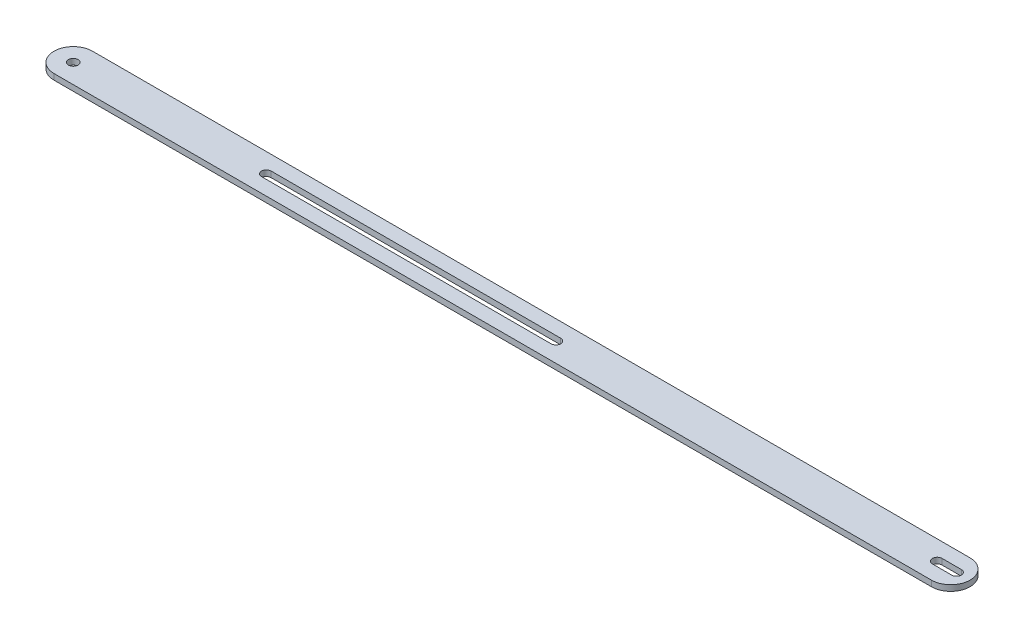
ISO-10303-21;
HEADER;
FILE_DESCRIPTION(('STEP AP214'),'2;1');
FILE_NAME('part.step','',(''),(''),'','','');
FILE_SCHEMA(('AUTOMOTIVE_DESIGN { 1 0 10303 214 1 1 1 1 }'));
ENDSEC;
DATA;
#1=APPLICATION_CONTEXT('core data for automotive mechanical design processes');
#2=APPLICATION_PROTOCOL_DEFINITION('international standard','automotive_design',2000,#1);
#3=PRODUCT_CONTEXT('',#1,'mechanical');
#4=PRODUCT('Part','Part','',(#3));
#5=PRODUCT_RELATED_PRODUCT_CATEGORY('part','',(#4));
#6=PRODUCT_DEFINITION_FORMATION('','',#4);
#7=PRODUCT_DEFINITION_CONTEXT('part definition',#1,'design');
#8=PRODUCT_DEFINITION('design','',#6,#7);
#9=PRODUCT_DEFINITION_SHAPE('','',#8);
#10=(LENGTH_UNIT() NAMED_UNIT(*) SI_UNIT(.MILLI.,.METRE.));
#11=(NAMED_UNIT(*) PLANE_ANGLE_UNIT() SI_UNIT($,.RADIAN.));
#12=(NAMED_UNIT(*) SI_UNIT($,.STERADIAN.) SOLID_ANGLE_UNIT());
#13=UNCERTAINTY_MEASURE_WITH_UNIT(LENGTH_MEASURE(1.E-05),#10,'distance_accuracy_value','');
#14=(GEOMETRIC_REPRESENTATION_CONTEXT(3) GLOBAL_UNCERTAINTY_ASSIGNED_CONTEXT((#13)) GLOBAL_UNIT_ASSIGNED_CONTEXT((#10,
#11,#12)) REPRESENTATION_CONTEXT('',''));
#15=CARTESIAN_POINT('',(0.,0.,0.));
#16=DIRECTION('',(0.,0.,1.));
#17=DIRECTION('',(1.,0.,0.));
#18=AXIS2_PLACEMENT_3D('',#15,#16,#17);
#19=CARTESIAN_POINT('',(-227.25,3.,0.));
#20=DIRECTION('',(0.,1.,0.));
#21=DIRECTION('',(0.,0.,1.));
#22=AXIS2_PLACEMENT_3D('',#19,#20,#21);
#23=PLANE('',#22);
#24=CARTESIAN_POINT('',(-127.25,3.,0.));
#25=DIRECTION('',(0.,1.,0.));
#26=DIRECTION('',(0.,0.,1.));
#27=AXIS2_PLACEMENT_3D('',#24,#25,#26);
#28=CIRCLE('',#27,2.5);
#29=CARTESIAN_POINT('',(-127.25,3.,-2.5));
#30=VERTEX_POINT('',#29);
#31=CARTESIAN_POINT('',(-127.25,3.,2.5));
#32=VERTEX_POINT('',#31);
#33=EDGE_CURVE('E50',#30,#32,#28,.T.);
#34=ORIENTED_EDGE('',*,*,#33,.F.);
#35=DIRECTION('',(-1.,0.,0.));
#36=VECTOR('',#35,1.);
#37=CARTESIAN_POINT('',(-127.25,3.,-2.5));
#38=LINE('',#37,#36);
#39=CARTESIAN_POINT('',(22.75,3.,-2.5));
#40=VERTEX_POINT('',#39);
#41=EDGE_CURVE('E142',#40,#30,#38,.T.);
#42=ORIENTED_EDGE('',*,*,#41,.F.);
#43=CARTESIAN_POINT('',(22.75,3.,0.));
#44=DIRECTION('',(0.,1.,0.));
#45=DIRECTION('',(0.,0.,1.));
#46=AXIS2_PLACEMENT_3D('',#43,#44,#45);
#47=CIRCLE('',#46,2.5);
#48=CARTESIAN_POINT('',(22.75,3.,2.5));
#49=VERTEX_POINT('',#48);
#50=EDGE_CURVE('E145',#49,#40,#47,.T.);
#51=ORIENTED_EDGE('',*,*,#50,.F.);
#52=DIRECTION('',(1.,0.,0.));
#53=VECTOR('',#52,1.);
#54=CARTESIAN_POINT('',(-127.25,3.,2.5));
#55=LINE('',#54,#53);
#56=EDGE_CURVE('E151',#32,#49,#55,.T.);
#57=ORIENTED_EDGE('',*,*,#56,.F.);
#58=EDGE_LOOP('',(#34,#42,#51,#57));
#59=FACE_BOUND('',#58,.T.);
#60=CARTESIAN_POINT('',(-227.25,3.,0.));
#61=DIRECTION('',(0.,1.,0.));
#62=DIRECTION('',(0.,0.,1.));
#63=AXIS2_PLACEMENT_3D('',#60,#61,#62);
#64=CIRCLE('',#63,10.0000000000001);
#65=CARTESIAN_POINT('',(-227.25,3.,-10.0000000000001));
#66=VERTEX_POINT('',#65);
#67=CARTESIAN_POINT('',(-227.25,3.,10.0000000000001));
#68=VERTEX_POINT('',#67);
#69=EDGE_CURVE('E198',#66,#68,#64,.T.);
#70=ORIENTED_EDGE('',*,*,#69,.T.);
#71=DIRECTION('',(1.,0.,0.));
#72=VECTOR('',#71,1.);
#73=CARTESIAN_POINT('',(-227.25,3.,10.0000000000001));
#74=LINE('',#73,#72);
#75=CARTESIAN_POINT('',(227.25,3.,10.0000000000001));
#76=VERTEX_POINT('',#75);
#77=EDGE_CURVE('E201',#68,#76,#74,.T.);
#78=ORIENTED_EDGE('',*,*,#77,.T.);
#79=CARTESIAN_POINT('',(227.25,3.,0.));
#80=DIRECTION('',(0.,1.,0.));
#81=DIRECTION('',(0.,0.,1.));
#82=AXIS2_PLACEMENT_3D('',#79,#80,#81);
#83=CIRCLE('',#82,10.0000000000001);
#84=CARTESIAN_POINT('',(227.25,3.,-10.0000000000001));
#85=VERTEX_POINT('',#84);
#86=EDGE_CURVE('E204',#76,#85,#83,.T.);
#87=ORIENTED_EDGE('',*,*,#86,.T.);
#88=DIRECTION('',(-1.,0.,0.));
#89=VECTOR('',#88,1.);
#90=CARTESIAN_POINT('',(-227.25,3.,-10.0000000000001));
#91=LINE('',#90,#89);
#92=EDGE_CURVE('E206',#85,#66,#91,.T.);
#93=ORIENTED_EDGE('',*,*,#92,.T.);
#94=EDGE_LOOP('',(#70,#78,#87,#93));
#95=FACE_BOUND('',#94,.T.);
#96=CARTESIAN_POINT('',(-227.25,3.,0.));
#97=DIRECTION('',(0.,1.,0.));
#98=DIRECTION('',(0.,0.,1.));
#99=AXIS2_PLACEMENT_3D('',#96,#97,#98);
#100=CIRCLE('',#99,2.5);
#101=CARTESIAN_POINT('',(-227.25,3.,2.49999999999995));
#102=VERTEX_POINT('',#101);
#103=EDGE_CURVE('E192',#102,#102,#100,.T.);
#104=ORIENTED_EDGE('',*,*,#103,.F.);
#105=EDGE_LOOP('',(#104));
#106=FACE_BOUND('',#105,.T.);
#107=DIRECTION('',(-1.,0.,0.));
#108=VECTOR('',#107,1.);
#109=CARTESIAN_POINT('',(230.25,3.,-2.50000000000018));
#110=LINE('',#109,#108);
#111=CARTESIAN_POINT('',(230.25,3.,-2.50000000000018));
#112=VERTEX_POINT('',#111);
#113=CARTESIAN_POINT('',(220.25,3.,-2.50000000000017));
#114=VERTEX_POINT('',#113);
#115=EDGE_CURVE('E163',#112,#114,#110,.T.);
#116=ORIENTED_EDGE('',*,*,#115,.F.);
#117=CARTESIAN_POINT('',(230.25,3.,-1.76430556873281E-13));
#118=DIRECTION('',(0.,1.,0.));
#119=DIRECTION('',(0.,0.,1.));
#120=AXIS2_PLACEMENT_3D('',#117,#118,#119);
#121=CIRCLE('',#120,2.5);
#122=CARTESIAN_POINT('',(230.25,3.,2.49999999999982));
#123=VERTEX_POINT('',#122);
#124=EDGE_CURVE('E161',#123,#112,#121,.T.);
#125=ORIENTED_EDGE('',*,*,#124,.F.);
#126=DIRECTION('',(1.,0.,0.));
#127=VECTOR('',#126,1.);
#128=CARTESIAN_POINT('',(230.25,3.,2.49999999999982));
#129=LINE('',#128,#127);
#130=CARTESIAN_POINT('',(220.25,3.,2.49999999999999));
#131=VERTEX_POINT('',#130);
#132=EDGE_CURVE('E169',#131,#123,#129,.T.);
#133=ORIENTED_EDGE('',*,*,#132,.F.);
#134=CARTESIAN_POINT('',(220.25,3.,-1.75205910074134E-13));
#135=DIRECTION('',(0.,1.,0.));
#136=DIRECTION('',(0.,0.,1.));
#137=AXIS2_PLACEMENT_3D('',#134,#135,#136);
#138=CIRCLE('',#137,2.5);
#139=EDGE_CURVE('E166',#114,#131,#138,.T.);
#140=ORIENTED_EDGE('',*,*,#139,.F.);
#141=EDGE_LOOP('',(#116,#125,#133,#140));
#142=FACE_BOUND('',#141,.T.);
#143=ADVANCED_FACE('F35',(#59,#95,#106,#142),#23,.T.);
#144=CARTESIAN_POINT('',(-227.25,0.,0.));
#145=DIRECTION('',(0.,1.,0.));
#146=DIRECTION('',(0.,0.,1.));
#147=AXIS2_PLACEMENT_3D('',#144,#145,#146);
#148=PLANE('',#147);
#149=DIRECTION('',(-1.,0.,0.));
#150=VECTOR('',#149,1.);
#151=CARTESIAN_POINT('',(-127.25,0.,-2.5));
#152=LINE('',#151,#150);
#153=CARTESIAN_POINT('',(22.75,0.,-2.5));
#154=VERTEX_POINT('',#153);
#155=CARTESIAN_POINT('',(-127.25,0.,-2.5));
#156=VERTEX_POINT('',#155);
#157=EDGE_CURVE('E132',#154,#156,#152,.T.);
#158=ORIENTED_EDGE('',*,*,#157,.T.);
#159=CARTESIAN_POINT('',(-127.25,0.,0.));
#160=DIRECTION('',(0.,1.,0.));
#161=DIRECTION('',(0.,0.,1.));
#162=AXIS2_PLACEMENT_3D('',#159,#160,#161);
#163=CIRCLE('',#162,2.5);
#164=CARTESIAN_POINT('',(-127.25,0.,2.5));
#165=VERTEX_POINT('',#164);
#166=EDGE_CURVE('E126',#156,#165,#163,.T.);
#167=ORIENTED_EDGE('',*,*,#166,.T.);
#168=DIRECTION('',(1.,0.,0.));
#169=VECTOR('',#168,1.);
#170=CARTESIAN_POINT('',(-127.25,0.,2.5));
#171=LINE('',#170,#169);
#172=CARTESIAN_POINT('',(22.75,0.,2.5));
#173=VERTEX_POINT('',#172);
#174=EDGE_CURVE('E135',#165,#173,#171,.T.);
#175=ORIENTED_EDGE('',*,*,#174,.T.);
#176=CARTESIAN_POINT('',(22.75,0.,0.));
#177=DIRECTION('',(0.,1.,0.));
#178=DIRECTION('',(0.,0.,1.));
#179=AXIS2_PLACEMENT_3D('',#176,#177,#178);
#180=CIRCLE('',#179,2.5);
#181=EDGE_CURVE('E58',#173,#154,#180,.T.);
#182=ORIENTED_EDGE('',*,*,#181,.T.);
#183=EDGE_LOOP('',(#158,#167,#175,#182));
#184=FACE_BOUND('',#183,.T.);
#185=CARTESIAN_POINT('',(-227.25,0.,0.));
#186=DIRECTION('',(0.,1.,0.));
#187=DIRECTION('',(0.,0.,1.));
#188=AXIS2_PLACEMENT_3D('',#185,#186,#187);
#189=CIRCLE('',#188,2.5);
#190=CARTESIAN_POINT('',(-227.25,0.,2.49999999999995));
#191=VERTEX_POINT('',#190);
#192=EDGE_CURVE('E191',#191,#191,#189,.T.);
#193=ORIENTED_EDGE('',*,*,#192,.T.);
#194=EDGE_LOOP('',(#193));
#195=FACE_BOUND('',#194,.T.);
#196=CARTESIAN_POINT('',(-227.25,0.,0.));
#197=DIRECTION('',(0.,1.,0.));
#198=DIRECTION('',(0.,0.,1.));
#199=AXIS2_PLACEMENT_3D('',#196,#197,#198);
#200=CIRCLE('',#199,10.0000000000001);
#201=CARTESIAN_POINT('',(-227.25,0.,-10.0000000000001));
#202=VERTEX_POINT('',#201);
#203=CARTESIAN_POINT('',(-227.25,0.,10.0000000000001));
#204=VERTEX_POINT('',#203);
#205=EDGE_CURVE('E195',#202,#204,#200,.T.);
#206=ORIENTED_EDGE('',*,*,#205,.F.);
#207=DIRECTION('',(-1.,0.,0.));
#208=VECTOR('',#207,1.);
#209=CARTESIAN_POINT('',(-227.25,0.,-10.0000000000001));
#210=LINE('',#209,#208);
#211=CARTESIAN_POINT('',(227.25,0.,-10.0000000000001));
#212=VERTEX_POINT('',#211);
#213=EDGE_CURVE('E202',#212,#202,#210,.T.);
#214=ORIENTED_EDGE('',*,*,#213,.F.);
#215=CARTESIAN_POINT('',(227.25,0.,0.));
#216=DIRECTION('',(0.,1.,0.));
#217=DIRECTION('',(0.,0.,1.));
#218=AXIS2_PLACEMENT_3D('',#215,#216,#217);
#219=CIRCLE('',#218,10.0000000000001);
#220=CARTESIAN_POINT('',(227.25,0.,10.0000000000001));
#221=VERTEX_POINT('',#220);
#222=EDGE_CURVE('E213',#221,#212,#219,.T.);
#223=ORIENTED_EDGE('',*,*,#222,.F.);
#224=DIRECTION('',(1.,0.,0.));
#225=VECTOR('',#224,1.);
#226=CARTESIAN_POINT('',(-227.25,0.,10.0000000000001));
#227=LINE('',#226,#225);
#228=EDGE_CURVE('E211',#204,#221,#227,.T.);
#229=ORIENTED_EDGE('',*,*,#228,.F.);
#230=EDGE_LOOP('',(#206,#214,#223,#229));
#231=FACE_BOUND('',#230,.T.);
#232=CARTESIAN_POINT('',(230.25,0.,-1.76430556873281E-13));
#233=DIRECTION('',(0.,1.,0.));
#234=DIRECTION('',(0.,0.,1.));
#235=AXIS2_PLACEMENT_3D('',#232,#233,#234);
#236=CIRCLE('',#235,2.5);
#237=CARTESIAN_POINT('',(230.25,0.,2.49999999999982));
#238=VERTEX_POINT('',#237);
#239=CARTESIAN_POINT('',(230.25,0.,-2.50000000000018));
#240=VERTEX_POINT('',#239);
#241=EDGE_CURVE('E157',#238,#240,#236,.T.);
#242=ORIENTED_EDGE('',*,*,#241,.T.);
#243=DIRECTION('',(-1.,0.,0.));
#244=VECTOR('',#243,1.);
#245=CARTESIAN_POINT('',(230.25,0.,-2.50000000000018));
#246=LINE('',#245,#244);
#247=CARTESIAN_POINT('',(220.25,0.,-2.50000000000017));
#248=VERTEX_POINT('',#247);
#249=EDGE_CURVE('E174',#240,#248,#246,.T.);
#250=ORIENTED_EDGE('',*,*,#249,.T.);
#251=CARTESIAN_POINT('',(220.25,0.,-1.75205910074134E-13));
#252=DIRECTION('',(0.,1.,0.));
#253=DIRECTION('',(0.,0.,1.));
#254=AXIS2_PLACEMENT_3D('',#251,#252,#253);
#255=CIRCLE('',#254,2.5);
#256=CARTESIAN_POINT('',(220.25,0.,2.49999999999999));
#257=VERTEX_POINT('',#256);
#258=EDGE_CURVE('E177',#248,#257,#255,.T.);
#259=ORIENTED_EDGE('',*,*,#258,.T.);
#260=DIRECTION('',(1.,0.,0.));
#261=VECTOR('',#260,1.);
#262=CARTESIAN_POINT('',(230.25,0.,2.49999999999982));
#263=LINE('',#262,#261);
#264=EDGE_CURVE('E164',#257,#238,#263,.T.);
#265=ORIENTED_EDGE('',*,*,#264,.T.);
#266=EDGE_LOOP('',(#242,#250,#259,#265));
#267=FACE_BOUND('',#266,.T.);
#268=ADVANCED_FACE('F139',(#184,#195,#231,#267),#148,.F.);
#269=CARTESIAN_POINT('',(-227.25,3.,0.));
#270=DIRECTION('',(0.,-1.,0.));
#271=DIRECTION('',(0.,0.,-1.));
#272=AXIS2_PLACEMENT_3D('',#269,#270,#271);
#273=CYLINDRICAL_SURFACE('',#272,10.0000000000001);
#274=ORIENTED_EDGE('',*,*,#205,.T.);
#275=DIRECTION('',(0.,-1.,0.));
#276=VECTOR('',#275,1.);
#277=CARTESIAN_POINT('',(-227.25,3.,10.0000000000001));
#278=LINE('',#277,#276);
#279=EDGE_CURVE('E11',#68,#204,#278,.T.);
#280=ORIENTED_EDGE('',*,*,#279,.F.);
#281=ORIENTED_EDGE('',*,*,#69,.F.);
#282=DIRECTION('',(0.,-1.,0.));
#283=VECTOR('',#282,1.);
#284=CARTESIAN_POINT('',(-227.25,3.,-10.0000000000001));
#285=LINE('',#284,#283);
#286=EDGE_CURVE('E208',#66,#202,#285,.T.);
#287=ORIENTED_EDGE('',*,*,#286,.T.);
#288=EDGE_LOOP('',(#274,#280,#281,#287));
#289=FACE_BOUND('',#288,.T.);
#290=ADVANCED_FACE('F37',(#289),#273,.T.);
#291=CARTESIAN_POINT('',(-227.25,3.,10.0000000000001));
#292=DIRECTION('',(0.,0.,-1.));
#293=DIRECTION('',(-1.,0.,0.));
#294=AXIS2_PLACEMENT_3D('',#291,#292,#293);
#295=PLANE('',#294);
#296=ORIENTED_EDGE('',*,*,#228,.T.);
#297=DIRECTION('',(0.,-1.,0.));
#298=VECTOR('',#297,1.);
#299=CARTESIAN_POINT('',(227.25,3.,10.0000000000001));
#300=LINE('',#299,#298);
#301=EDGE_CURVE('E43',#76,#221,#300,.T.);
#302=ORIENTED_EDGE('',*,*,#301,.F.);
#303=ORIENTED_EDGE('',*,*,#77,.F.);
#304=ORIENTED_EDGE('',*,*,#279,.T.);
#305=EDGE_LOOP('',(#296,#302,#303,#304));
#306=FACE_BOUND('',#305,.T.);
#307=ADVANCED_FACE('F241',(#306),#295,.F.);
#308=CARTESIAN_POINT('',(227.25,3.,0.));
#309=DIRECTION('',(0.,-1.,0.));
#310=DIRECTION('',(0.,0.,-1.));
#311=AXIS2_PLACEMENT_3D('',#308,#309,#310);
#312=CYLINDRICAL_SURFACE('',#311,10.0000000000001);
#313=ORIENTED_EDGE('',*,*,#222,.T.);
#314=DIRECTION('',(0.,-1.,0.));
#315=VECTOR('',#314,1.);
#316=CARTESIAN_POINT('',(227.25,3.,-10.0000000000001));
#317=LINE('',#316,#315);
#318=EDGE_CURVE('E218',#85,#212,#317,.T.);
#319=ORIENTED_EDGE('',*,*,#318,.F.);
#320=ORIENTED_EDGE('',*,*,#86,.F.);
#321=ORIENTED_EDGE('',*,*,#301,.T.);
#322=EDGE_LOOP('',(#313,#319,#320,#321));
#323=FACE_BOUND('',#322,.T.);
#324=ADVANCED_FACE('F225',(#323),#312,.T.);
#325=CARTESIAN_POINT('',(-227.25,3.,-10.0000000000001));
#326=DIRECTION('',(0.,0.,1.));
#327=DIRECTION('',(1.,0.,0.));
#328=AXIS2_PLACEMENT_3D('',#325,#326,#327);
#329=PLANE('',#328);
#330=ORIENTED_EDGE('',*,*,#213,.T.);
#331=ORIENTED_EDGE('',*,*,#286,.F.);
#332=ORIENTED_EDGE('',*,*,#92,.F.);
#333=ORIENTED_EDGE('',*,*,#318,.T.);
#334=EDGE_LOOP('',(#330,#331,#332,#333));
#335=FACE_BOUND('',#334,.T.);
#336=ADVANCED_FACE('F234',(#335),#329,.F.);
#337=CARTESIAN_POINT('',(-227.25,3.,0.));
#338=DIRECTION('',(0.,-1.,0.));
#339=DIRECTION('',(0.,0.,-1.));
#340=AXIS2_PLACEMENT_3D('',#337,#338,#339);
#341=CYLINDRICAL_SURFACE('',#340,2.5);
#342=ORIENTED_EDGE('',*,*,#103,.T.);
#343=EDGE_LOOP('',(#342));
#344=FACE_BOUND('',#343,.T.);
#345=ORIENTED_EDGE('',*,*,#192,.F.);
#346=EDGE_LOOP('',(#345));
#347=FACE_BOUND('',#346,.T.);
#348=ADVANCED_FACE('F256',(#344,#347),#341,.F.);
#349=CARTESIAN_POINT('',(230.25,3.,-1.76430556873281E-13));
#350=DIRECTION('',(0.,-1.,0.));
#351=DIRECTION('',(0.,0.,-1.));
#352=AXIS2_PLACEMENT_3D('',#349,#350,#351);
#353=CYLINDRICAL_SURFACE('',#352,2.5);
#354=ORIENTED_EDGE('',*,*,#241,.F.);
#355=DIRECTION('',(0.,-1.,0.));
#356=VECTOR('',#355,1.);
#357=CARTESIAN_POINT('',(230.25,3.,2.49999999999982));
#358=LINE('',#357,#356);
#359=EDGE_CURVE('E171',#123,#238,#358,.T.);
#360=ORIENTED_EDGE('',*,*,#359,.F.);
#361=ORIENTED_EDGE('',*,*,#124,.T.);
#362=DIRECTION('',(0.,-1.,0.));
#363=VECTOR('',#362,1.);
#364=CARTESIAN_POINT('',(230.25,3.,-2.50000000000018));
#365=LINE('',#364,#363);
#366=EDGE_CURVE('E188',#112,#240,#365,.T.);
#367=ORIENTED_EDGE('',*,*,#366,.T.);
#368=EDGE_LOOP('',(#354,#360,#361,#367));
#369=FACE_BOUND('',#368,.T.);
#370=ADVANCED_FACE('F263',(#369),#353,.F.);
#371=CARTESIAN_POINT('',(230.25,3.,-2.50000000000018));
#372=DIRECTION('',(0.,0.,1.));
#373=DIRECTION('',(1.,0.,0.));
#374=AXIS2_PLACEMENT_3D('',#371,#372,#373);
#375=PLANE('',#374);
#376=ORIENTED_EDGE('',*,*,#249,.F.);
#377=ORIENTED_EDGE('',*,*,#366,.F.);
#378=ORIENTED_EDGE('',*,*,#115,.T.);
#379=DIRECTION('',(0.,-1.,0.));
#380=VECTOR('',#379,1.);
#381=CARTESIAN_POINT('',(220.25,3.,-2.50000000000017));
#382=LINE('',#381,#380);
#383=EDGE_CURVE('E186',#114,#248,#382,.T.);
#384=ORIENTED_EDGE('',*,*,#383,.T.);
#385=EDGE_LOOP('',(#376,#377,#378,#384));
#386=FACE_BOUND('',#385,.T.);
#387=ADVANCED_FACE('F268',(#386),#375,.T.);
#388=CARTESIAN_POINT('',(220.25,3.,-1.75205910074134E-13));
#389=DIRECTION('',(0.,-1.,0.));
#390=DIRECTION('',(0.,0.,-1.));
#391=AXIS2_PLACEMENT_3D('',#388,#389,#390);
#392=CYLINDRICAL_SURFACE('',#391,2.5);
#393=ORIENTED_EDGE('',*,*,#258,.F.);
#394=ORIENTED_EDGE('',*,*,#383,.F.);
#395=ORIENTED_EDGE('',*,*,#139,.T.);
#396=DIRECTION('',(0.,-1.,0.));
#397=VECTOR('',#396,1.);
#398=CARTESIAN_POINT('',(220.25,3.,2.49999999999999));
#399=LINE('',#398,#397);
#400=EDGE_CURVE('E184',#131,#257,#399,.T.);
#401=ORIENTED_EDGE('',*,*,#400,.T.);
#402=EDGE_LOOP('',(#393,#394,#395,#401));
#403=FACE_BOUND('',#402,.T.);
#404=ADVANCED_FACE('F283',(#403),#392,.F.);
#405=CARTESIAN_POINT('',(230.25,3.,2.49999999999982));
#406=DIRECTION('',(0.,0.,-1.));
#407=DIRECTION('',(-1.,0.,0.));
#408=AXIS2_PLACEMENT_3D('',#405,#406,#407);
#409=PLANE('',#408);
#410=ORIENTED_EDGE('',*,*,#264,.F.);
#411=ORIENTED_EDGE('',*,*,#400,.F.);
#412=ORIENTED_EDGE('',*,*,#132,.T.);
#413=ORIENTED_EDGE('',*,*,#359,.T.);
#414=EDGE_LOOP('',(#410,#411,#412,#413));
#415=FACE_BOUND('',#414,.T.);
#416=ADVANCED_FACE('F287',(#415),#409,.T.);
#417=CARTESIAN_POINT('',(-127.25,0.,0.));
#418=DIRECTION('',(0.,1.,0.));
#419=DIRECTION('',(0.,0.,1.));
#420=AXIS2_PLACEMENT_3D('',#417,#418,#419);
#421=CYLINDRICAL_SURFACE('',#420,2.5);
#422=ORIENTED_EDGE('',*,*,#33,.T.);
#423=DIRECTION('',(0.,1.,0.));
#424=VECTOR('',#423,1.);
#425=CARTESIAN_POINT('',(-127.25,0.,2.5));
#426=LINE('',#425,#424);
#427=EDGE_CURVE('E122',#165,#32,#426,.T.);
#428=ORIENTED_EDGE('',*,*,#427,.F.);
#429=ORIENTED_EDGE('',*,*,#166,.F.);
#430=DIRECTION('',(0.,1.,0.));
#431=VECTOR('',#430,1.);
#432=CARTESIAN_POINT('',(-127.25,0.,-2.5));
#433=LINE('',#432,#431);
#434=EDGE_CURVE('E155',#156,#30,#433,.T.);
#435=ORIENTED_EDGE('',*,*,#434,.T.);
#436=EDGE_LOOP('',(#422,#428,#429,#435));
#437=FACE_BOUND('',#436,.T.);
#438=ADVANCED_FACE('F124',(#437),#421,.F.);
#439=CARTESIAN_POINT('',(-127.25,0.,-2.5));
#440=DIRECTION('',(0.,0.,-1.));
#441=DIRECTION('',(-1.,0.,0.));
#442=AXIS2_PLACEMENT_3D('',#439,#440,#441);
#443=PLANE('',#442);
#444=ORIENTED_EDGE('',*,*,#41,.T.);
#445=ORIENTED_EDGE('',*,*,#434,.F.);
#446=ORIENTED_EDGE('',*,*,#157,.F.);
#447=DIRECTION('',(0.,1.,0.));
#448=VECTOR('',#447,1.);
#449=CARTESIAN_POINT('',(22.75,0.,-2.5));
#450=LINE('',#449,#448);
#451=EDGE_CURVE('E158',#154,#40,#450,.T.);
#452=ORIENTED_EDGE('',*,*,#451,.T.);
#453=EDGE_LOOP('',(#444,#445,#446,#452));
#454=FACE_BOUND('',#453,.T.);
#455=ADVANCED_FACE('F294',(#454),#443,.F.);
#456=CARTESIAN_POINT('',(22.75,0.,0.));
#457=DIRECTION('',(0.,1.,0.));
#458=DIRECTION('',(0.,0.,1.));
#459=AXIS2_PLACEMENT_3D('',#456,#457,#458);
#460=CYLINDRICAL_SURFACE('',#459,2.5);
#461=ORIENTED_EDGE('',*,*,#50,.T.);
#462=ORIENTED_EDGE('',*,*,#451,.F.);
#463=ORIENTED_EDGE('',*,*,#181,.F.);
#464=DIRECTION('',(0.,1.,0.));
#465=VECTOR('',#464,1.);
#466=CARTESIAN_POINT('',(22.75,0.,2.5));
#467=LINE('',#466,#465);
#468=EDGE_CURVE('E131',#173,#49,#467,.T.);
#469=ORIENTED_EDGE('',*,*,#468,.T.);
#470=EDGE_LOOP('',(#461,#462,#463,#469));
#471=FACE_BOUND('',#470,.T.);
#472=ADVANCED_FACE('F338',(#471),#460,.F.);
#473=CARTESIAN_POINT('',(-127.25,0.,2.5));
#474=DIRECTION('',(0.,0.,1.));
#475=DIRECTION('',(1.,0.,0.));
#476=AXIS2_PLACEMENT_3D('',#473,#474,#475);
#477=PLANE('',#476);
#478=ORIENTED_EDGE('',*,*,#56,.T.);
#479=ORIENTED_EDGE('',*,*,#468,.F.);
#480=ORIENTED_EDGE('',*,*,#174,.F.);
#481=ORIENTED_EDGE('',*,*,#427,.T.);
#482=EDGE_LOOP('',(#478,#479,#480,#481));
#483=FACE_BOUND('',#482,.T.);
#484=ADVANCED_FACE('F136',(#483),#477,.F.);
#485=CLOSED_SHELL('',(#143,#268,#290,#307,#324,#336,#348,#370,#387,#404,#416,#438,#455,#472,#484));
#486=MANIFOLD_SOLID_BREP('B2',#485);
#487=ADVANCED_BREP_SHAPE_REPRESENTATION('',(#18,#486),#14);
#488=SHAPE_DEFINITION_REPRESENTATION(#9,#487);
ENDSEC;
END-ISO-10303-21;
